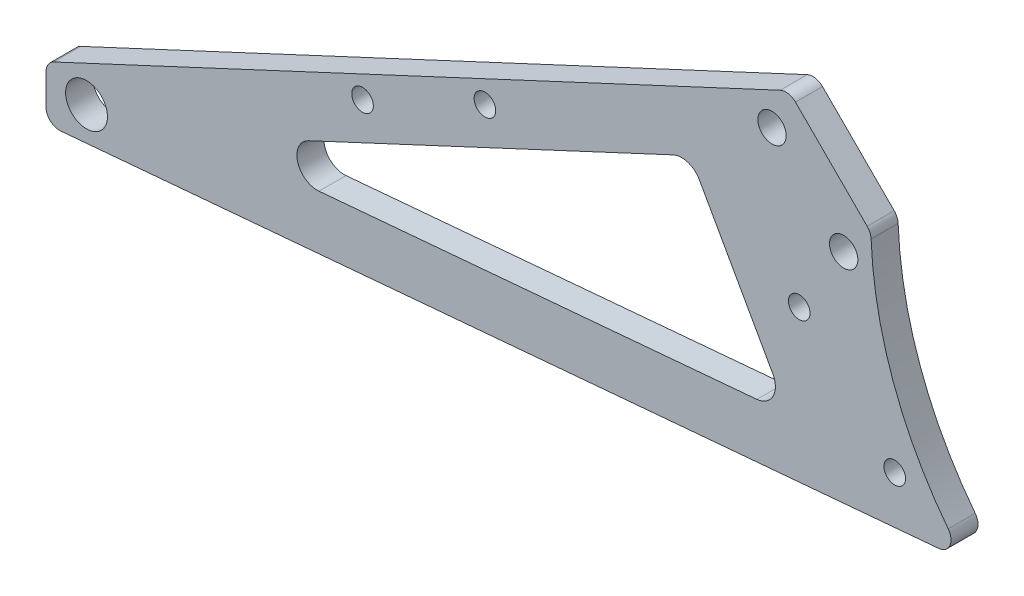
ISO-10303-21;
HEADER;
FILE_DESCRIPTION(('STEP AP214'),'2;1');
FILE_NAME('part.step','',(''),(''),'','','');
FILE_SCHEMA(('AUTOMOTIVE_DESIGN { 1 0 10303 214 1 1 1 1 }'));
ENDSEC;
DATA;
#1=APPLICATION_CONTEXT('core data for automotive mechanical design processes');
#2=APPLICATION_PROTOCOL_DEFINITION('international standard','automotive_design',2000,#1);
#3=PRODUCT_CONTEXT('',#1,'mechanical');
#4=PRODUCT('Part','Part','',(#3));
#5=PRODUCT_RELATED_PRODUCT_CATEGORY('part','',(#4));
#6=PRODUCT_DEFINITION_FORMATION('','',#4);
#7=PRODUCT_DEFINITION_CONTEXT('part definition',#1,'design');
#8=PRODUCT_DEFINITION('design','',#6,#7);
#9=PRODUCT_DEFINITION_SHAPE('','',#8);
#10=(LENGTH_UNIT() NAMED_UNIT(*) SI_UNIT(.MILLI.,.METRE.));
#11=(NAMED_UNIT(*) PLANE_ANGLE_UNIT() SI_UNIT($,.RADIAN.));
#12=(NAMED_UNIT(*) SI_UNIT($,.STERADIAN.) SOLID_ANGLE_UNIT());
#13=UNCERTAINTY_MEASURE_WITH_UNIT(LENGTH_MEASURE(1.E-05),#10,'distance_accuracy_value','');
#14=(GEOMETRIC_REPRESENTATION_CONTEXT(3) GLOBAL_UNCERTAINTY_ASSIGNED_CONTEXT((#13)) GLOBAL_UNIT_ASSIGNED_CONTEXT((#10,
#11,#12)) REPRESENTATION_CONTEXT('',''));
#15=CARTESIAN_POINT('',(0.,0.,0.));
#16=DIRECTION('',(0.,0.,1.));
#17=DIRECTION('',(1.,0.,0.));
#18=AXIS2_PLACEMENT_3D('',#15,#16,#17);
#19=CARTESIAN_POINT('',(67.1453009382805,-10.8085597787918,4.));
#20=DIRECTION('',(0.,0.,1.));
#21=DIRECTION('',(1.,0.,0.));
#22=AXIS2_PLACEMENT_3D('',#19,#20,#21);
#23=PLANE('',#22);
#24=DIRECTION('',(-0.488052623048348,0.872814205392893,0.));
#25=VECTOR('',#24,1.);
#26=CARTESIAN_POINT('',(-0.110692732415361,-41.5593104218611,4.));
#27=LINE('',#26,#25);
#28=CARTESIAN_POINT('',(-2.37248368296537,-37.5144120276288,4.));
#29=VERTEX_POINT('',#28);
#30=CARTESIAN_POINT('',(-13.2450822531965,-18.070282371364,4.));
#31=VERTEX_POINT('',#30);
#32=EDGE_CURVE('E286',#29,#31,#27,.T.);
#33=ORIENTED_EDGE('',*,*,#32,.F.);
#34=CARTESIAN_POINT('',(-4.99092629914405,-38.9785698967738,4.));
#35=DIRECTION('',(0.,0.,1.));
#36=DIRECTION('',(1.,0.,0.));
#37=AXIS2_PLACEMENT_3D('',#34,#35,#36);
#38=CIRCLE('',#37,3.);
#39=CARTESIAN_POINT('',(-4.72704819418893,-41.9669420867336,4.));
#40=VERTEX_POINT('',#39);
#41=EDGE_CURVE('E268',#29,#40,#38,.F.);
#42=ORIENTED_EDGE('',*,*,#41,.T.);
#43=DIRECTION('',(0.996124063319942,0.0879593683183776,0.));
#44=VECTOR('',#43,1.);
#45=CARTESIAN_POINT('',(-86.566111127394,-49.1934639070991,4.));
#46=LINE('',#45,#44);
#47=CARTESIAN_POINT('',(-69.5781435381829,-47.6933988517686,4.));
#48=VERTEX_POINT('',#47);
#49=EDGE_CURVE('E278',#48,#40,#46,.T.);
#50=ORIENTED_EDGE('',*,*,#49,.F.);
#51=CARTESIAN_POINT('',(-69.8420216431381,-44.7050266618088,4.));
#52=DIRECTION('',(0.,0.,1.));
#53=DIRECTION('',(1.,0.,0.));
#54=AXIS2_PLACEMENT_3D('',#51,#52,#53);
#55=CIRCLE('',#54,3.);
#56=CARTESIAN_POINT('',(-71.1098764283601,-41.9861033006988,4.));
#57=VERTEX_POINT('',#56);
#58=EDGE_CURVE('E48',#48,#57,#55,.F.);
#59=ORIENTED_EDGE('',*,*,#58,.T.);
#60=DIRECTION('',(-0.906307787036655,-0.422618261740689,0.));
#61=VECTOR('',#60,1.);
#62=CARTESIAN_POINT('',(-14.6053601461869,-15.6376146379784,4.));
#63=LINE('',#62,#61);
#64=CARTESIAN_POINT('',(-17.1313796545972,-16.8155168793991,4.));
#65=VERTEX_POINT('',#64);
#66=EDGE_CURVE('E277',#65,#57,#63,.T.);
#67=ORIENTED_EDGE('',*,*,#66,.F.);
#68=CARTESIAN_POINT('',(-15.8635248693752,-19.534440240509,4.));
#69=DIRECTION('',(0.,0.,1.));
#70=DIRECTION('',(1.,0.,0.));
#71=AXIS2_PLACEMENT_3D('',#68,#69,#70);
#72=CIRCLE('',#71,3.);
#73=EDGE_CURVE('E264',#65,#31,#72,.F.);
#74=ORIENTED_EDGE('',*,*,#73,.T.);
#75=EDGE_LOOP('',(#33,#42,#50,#59,#67,#74));
#76=FACE_BOUND('',#75,.T.);
#77=CARTESIAN_POINT('',(-45.,-24.2939783738617,4.));
#78=DIRECTION('',(0.,0.,1.));
#79=DIRECTION('',(1.,0.,0.));
#80=AXIS2_PLACEMENT_3D('',#77,#78,#79);
#81=CIRCLE('',#80,1.6);
#82=CARTESIAN_POINT('',(-43.4,-24.2939783738617,4.));
#83=VERTEX_POINT('',#82);
#84=EDGE_CURVE('E240',#83,#83,#81,.T.);
#85=ORIENTED_EDGE('',*,*,#84,.F.);
#86=EDGE_LOOP('',(#85));
#87=FACE_BOUND('',#86,.T.);
#88=CARTESIAN_POINT('',(-63.1261557407331,-32.7463436086755,4.));
#89=DIRECTION('',(0.,0.,1.));
#90=DIRECTION('',(1.,0.,0.));
#91=AXIS2_PLACEMENT_3D('',#88,#89,#90);
#92=CIRCLE('',#91,1.6);
#93=CARTESIAN_POINT('',(-61.5261557407331,-32.7463436086755,4.));
#94=VERTEX_POINT('',#93);
#95=EDGE_CURVE('E302',#94,#94,#92,.T.);
#96=ORIENTED_EDGE('',*,*,#95,.F.);
#97=EDGE_LOOP('',(#96));
#98=FACE_BOUND('',#97,.T.);
#99=CARTESIAN_POINT('',(-2.48528137423862,-6.,4.));
#100=DIRECTION('',(0.,0.,1.));
#101=DIRECTION('',(1.,0.,0.));
#102=AXIS2_PLACEMENT_3D('',#99,#100,#101);
#103=CIRCLE('',#102,2.1);
#104=CARTESIAN_POINT('',(-0.385281374238623,-6.,4.));
#105=VERTEX_POINT('',#104);
#106=EDGE_CURVE('E313',#105,#105,#103,.T.);
#107=ORIENTED_EDGE('',*,*,#106,.F.);
#108=EDGE_LOOP('',(#107));
#109=FACE_BOUND('',#108,.T.);
#110=CARTESIAN_POINT('',(8.12132034355943,-16.6066017177984,4.));
#111=DIRECTION('',(0.,0.,1.));
#112=DIRECTION('',(1.,0.,0.));
#113=AXIS2_PLACEMENT_3D('',#110,#111,#112);
#114=CIRCLE('',#113,2.1);
#115=CARTESIAN_POINT('',(10.2213203435594,-16.6066017177984,4.));
#116=VERTEX_POINT('',#115);
#117=EDGE_CURVE('E325',#116,#116,#114,.T.);
#118=ORIENTED_EDGE('',*,*,#117,.F.);
#119=EDGE_LOOP('',(#118));
#120=FACE_BOUND('',#119,.T.);
#121=CARTESIAN_POINT('',(67.1453009382805,-10.8085597787918,4.));
#122=DIRECTION('',(0.,0.,-1.));
#123=DIRECTION('',(1.,0.,0.));
#124=AXIS2_PLACEMENT_3D('',#121,#122,#123);
#125=CIRCLE('',#124,55.0000000000003);
#126=CARTESIAN_POINT('',(23.6005379703477,-44.4069766770115,4.));
#127=VERTEX_POINT('',#126);
#128=CARTESIAN_POINT('',(12.1865794076297,-12.9390357153855,4.));
#129=VERTEX_POINT('',#128);
#130=EDGE_CURVE('E190',#127,#129,#125,.T.);
#131=ORIENTED_EDGE('',*,*,#130,.T.);
#132=CARTESIAN_POINT('',(10.1880804428788,-13.0165075676253,4.));
#133=DIRECTION('',(0.,0.,1.));
#134=DIRECTION('',(1.,0.,0.));
#135=AXIS2_PLACEMENT_3D('',#132,#133,#134);
#136=CIRCLE('',#135,2.);
#137=CARTESIAN_POINT('',(11.6022940052519,-11.6022940052522,4.));
#138=VERTEX_POINT('',#137);
#139=EDGE_CURVE('E218',#129,#138,#136,.T.);
#140=ORIENTED_EDGE('',*,*,#139,.T.);
#141=DIRECTION('',(-0.707106781186537,0.707106781186558,0.));
#142=VECTOR('',#141,1.);
#143=CARTESIAN_POINT('',(0.,0.,4.));
#144=LINE('',#143,#142);
#145=CARTESIAN_POINT('',(0.990242997012051,-0.990242997012082,4.));
#146=VERTEX_POINT('',#145);
#147=EDGE_CURVE('E173',#138,#146,#144,.T.);
#148=ORIENTED_EDGE('',*,*,#147,.T.);
#149=CARTESIAN_POINT('',(-0.423970565361059,-2.40445655938515,4.));
#150=DIRECTION('',(0.,0.,1.));
#151=DIRECTION('',(1.,0.,0.));
#152=AXIS2_PLACEMENT_3D('',#149,#150,#151);
#153=CIRCLE('',#152,2.);
#154=CARTESIAN_POINT('',(-1.26920708884243,-0.591840985311821,4.));
#155=VERTEX_POINT('',#154);
#156=EDGE_CURVE('E210',#146,#155,#153,.T.);
#157=ORIENTED_EDGE('',*,*,#156,.T.);
#158=DIRECTION('',(-0.906307787036655,-0.422618261740689,0.));
#159=VECTOR('',#158,1.);
#160=CARTESIAN_POINT('',(-110.,-51.2938423970483,4.));
#161=LINE('',#160,#159);
#162=CARTESIAN_POINT('',(-108.845236523481,-50.7553673445899,4.));
#163=VERTEX_POINT('',#162);
#164=EDGE_CURVE('E333',#155,#163,#161,.T.);
#165=ORIENTED_EDGE('',*,*,#164,.T.);
#166=CARTESIAN_POINT('',(-108.,-52.5679829186633,4.));
#167=DIRECTION('',(0.,0.,1.));
#168=DIRECTION('',(1.,0.,0.));
#169=AXIS2_PLACEMENT_3D('',#166,#167,#168);
#170=CIRCLE('',#169,2.);
#171=CARTESIAN_POINT('',(-110.,-52.5679829186633,4.));
#172=VERTEX_POINT('',#171);
#173=EDGE_CURVE('E212',#163,#172,#170,.T.);
#174=ORIENTED_EDGE('',*,*,#173,.T.);
#175=DIRECTION('',(0.,-1.,0.));
#176=VECTOR('',#175,1.);
#177=CARTESIAN_POINT('',(-110.,-59.2938423970483,4.));
#178=LINE('',#177,#176);
#179=CARTESIAN_POINT('',(-110.,-57.1094571213982,4.));
#180=VERTEX_POINT('',#179);
#181=EDGE_CURVE('E336',#172,#180,#178,.T.);
#182=ORIENTED_EDGE('',*,*,#181,.T.);
#183=CARTESIAN_POINT('',(-108.,-57.1094571213982,4.));
#184=DIRECTION('',(0.,0.,1.));
#185=DIRECTION('',(1.,0.,0.));
#186=AXIS2_PLACEMENT_3D('',#183,#184,#185);
#187=CIRCLE('',#186,2.);
#188=CARTESIAN_POINT('',(-107.824081263363,-59.1017052480381,4.));
#189=VERTEX_POINT('',#188);
#190=EDGE_CURVE('E214',#180,#189,#187,.T.);
#191=ORIENTED_EDGE('',*,*,#190,.T.);
#192=DIRECTION('',(0.996124063319942,0.0879593683183777,0.));
#193=VECTOR('',#192,1.);
#194=CARTESIAN_POINT('',(25.9825746737338,-47.2863607880365,4.));
#195=LINE('',#194,#193);
#196=CARTESIAN_POINT('',(22.1930107808778,-47.6209854181321,4.));
#197=VERTEX_POINT('',#196);
#198=EDGE_CURVE('E338',#189,#197,#195,.T.);
#199=ORIENTED_EDGE('',*,*,#198,.T.);
#200=CARTESIAN_POINT('',(22.0170920442411,-45.6287372914922,4.));
#201=DIRECTION('',(0.,0.,1.));
#202=DIRECTION('',(1.,0.,0.));
#203=AXIS2_PLACEMENT_3D('',#200,#201,#202);
#204=CIRCLE('',#203,2.);
#205=EDGE_CURVE('E216',#197,#127,#204,.T.);
#206=ORIENTED_EDGE('',*,*,#205,.T.);
#207=EDGE_LOOP('',(#131,#140,#148,#157,#165,#174,#182,#191,#199,#206));
#208=FACE_BOUND('',#207,.T.);
#209=CARTESIAN_POINT('',(-104.,-53.8137596900725,4.));
#210=DIRECTION('',(0.,0.,1.));
#211=DIRECTION('',(1.,0.,0.));
#212=AXIS2_PLACEMENT_3D('',#209,#210,#211);
#213=CIRCLE('',#212,3.1);
#214=CARTESIAN_POINT('',(-100.9,-53.8137596900725,4.));
#215=VERTEX_POINT('',#214);
#216=EDGE_CURVE('E181',#215,#215,#213,.T.);
#217=ORIENTED_EDGE('',*,*,#216,.F.);
#218=EDGE_LOOP('',(#217));
#219=FACE_BOUND('',#218,.T.);
#220=CARTESIAN_POINT('',(1.54415587728385,-27.,4.));
#221=DIRECTION('',(0.,0.,1.));
#222=DIRECTION('',(1.,0.,0.));
#223=AXIS2_PLACEMENT_3D('',#220,#221,#222);
#224=CIRCLE('',#223,1.6);
#225=CARTESIAN_POINT('',(3.14415587728385,-27.,4.));
#226=VERTEX_POINT('',#225);
#227=EDGE_CURVE('E319',#226,#226,#224,.T.);
#228=ORIENTED_EDGE('',*,*,#227,.F.);
#229=EDGE_LOOP('',(#228));
#230=FACE_BOUND('',#229,.T.);
#231=CARTESIAN_POINT('',(15.6862915010146,-41.1421356237312,4.));
#232=DIRECTION('',(0.,0.,1.));
#233=DIRECTION('',(1.,0.,0.));
#234=AXIS2_PLACEMENT_3D('',#231,#232,#233);
#235=CIRCLE('',#234,1.60000000000001);
#236=CARTESIAN_POINT('',(17.2862915010146,-41.1421356237312,4.));
#237=VERTEX_POINT('',#236);
#238=EDGE_CURVE('E307',#237,#237,#235,.T.);
#239=ORIENTED_EDGE('',*,*,#238,.F.);
#240=EDGE_LOOP('',(#239));
#241=FACE_BOUND('',#240,.T.);
#242=ADVANCED_FACE('F40',(#76,#87,#98,#109,#120,#208,#219,#230,#241),#23,.T.);
#243=CARTESIAN_POINT('',(67.1453009382805,-10.8085597787918,0.));
#244=DIRECTION('',(0.,0.,1.));
#245=DIRECTION('',(1.,0.,0.));
#246=AXIS2_PLACEMENT_3D('',#243,#244,#245);
#247=PLANE('',#246);
#248=DIRECTION('',(-0.906307787036655,-0.422618261740689,0.));
#249=VECTOR('',#248,1.);
#250=CARTESIAN_POINT('',(54.3937617306355,16.5372042991529,0.));
#251=LINE('',#250,#249);
#252=CARTESIAN_POINT('',(-17.1313796545973,-16.8155168793991,0.));
#253=VERTEX_POINT('',#252);
#254=CARTESIAN_POINT('',(-71.1098764283602,-41.9861033006988,0.));
#255=VERTEX_POINT('',#254);
#256=EDGE_CURVE('E235',#253,#255,#251,.T.);
#257=ORIENTED_EDGE('',*,*,#256,.T.);
#258=CARTESIAN_POINT('',(-69.8420216431381,-44.7050266618088,0.));
#259=DIRECTION('',(0.,0.,1.));
#260=DIRECTION('',(1.,0.,0.));
#261=AXIS2_PLACEMENT_3D('',#258,#259,#260);
#262=CIRCLE('',#261,3.);
#263=CARTESIAN_POINT('',(-69.5781435381829,-47.6933988517686,0.));
#264=VERTEX_POINT('',#263);
#265=EDGE_CURVE('E11',#255,#264,#262,.T.);
#266=ORIENTED_EDGE('',*,*,#265,.T.);
#267=DIRECTION('',(0.996124063319942,0.0879593683183776,0.));
#268=VECTOR('',#267,1.);
#269=CARTESIAN_POINT('',(69.3192842757052,-35.4285309889861,0.));
#270=LINE('',#269,#268);
#271=CARTESIAN_POINT('',(-4.72704819418893,-41.9669420867336,0.));
#272=VERTEX_POINT('',#271);
#273=EDGE_CURVE('E245',#264,#272,#270,.T.);
#274=ORIENTED_EDGE('',*,*,#273,.T.);
#275=CARTESIAN_POINT('',(-4.99092629914405,-38.9785698967738,0.));
#276=DIRECTION('',(0.,0.,1.));
#277=DIRECTION('',(1.,0.,0.));
#278=AXIS2_PLACEMENT_3D('',#275,#276,#277);
#279=CIRCLE('',#278,3.);
#280=CARTESIAN_POINT('',(-2.37248368296536,-37.5144120276288,0.));
#281=VERTEX_POINT('',#280);
#282=EDGE_CURVE('E270',#272,#281,#279,.T.);
#283=ORIENTED_EDGE('',*,*,#282,.T.);
#284=DIRECTION('',(-0.488052623048347,0.872814205392893,0.));
#285=VECTOR('',#284,1.);
#286=CARTESIAN_POINT('',(2.8101910083413,-46.7829045607681,0.));
#287=LINE('',#286,#285);
#288=CARTESIAN_POINT('',(-13.2450822531965,-18.070282371364,0.));
#289=VERTEX_POINT('',#288);
#290=EDGE_CURVE('E247',#281,#289,#287,.T.);
#291=ORIENTED_EDGE('',*,*,#290,.T.);
#292=CARTESIAN_POINT('',(-15.8635248693752,-19.534440240509,0.));
#293=DIRECTION('',(0.,0.,1.));
#294=DIRECTION('',(1.,0.,0.));
#295=AXIS2_PLACEMENT_3D('',#292,#293,#294);
#296=CIRCLE('',#295,3.);
#297=EDGE_CURVE('E266',#289,#253,#296,.T.);
#298=ORIENTED_EDGE('',*,*,#297,.T.);
#299=EDGE_LOOP('',(#257,#266,#274,#283,#291,#298));
#300=FACE_BOUND('',#299,.T.);
#301=CARTESIAN_POINT('',(-45.,-24.2939783738617,0.));
#302=DIRECTION('',(0.,0.,1.));
#303=DIRECTION('',(1.,0.,0.));
#304=AXIS2_PLACEMENT_3D('',#301,#302,#303);
#305=CIRCLE('',#304,1.6);
#306=CARTESIAN_POINT('',(-43.4,-24.2939783738617,0.));
#307=VERTEX_POINT('',#306);
#308=EDGE_CURVE('E239',#307,#307,#305,.T.);
#309=ORIENTED_EDGE('',*,*,#308,.T.);
#310=EDGE_LOOP('',(#309));
#311=FACE_BOUND('',#310,.T.);
#312=CARTESIAN_POINT('',(-63.1261557407331,-32.7463436086755,0.));
#313=DIRECTION('',(0.,0.,1.));
#314=DIRECTION('',(1.,0.,0.));
#315=AXIS2_PLACEMENT_3D('',#312,#313,#314);
#316=CIRCLE('',#315,1.6);
#317=CARTESIAN_POINT('',(-61.5261557407331,-32.7463436086755,0.));
#318=VERTEX_POINT('',#317);
#319=EDGE_CURVE('E236',#318,#318,#316,.T.);
#320=ORIENTED_EDGE('',*,*,#319,.T.);
#321=EDGE_LOOP('',(#320));
#322=FACE_BOUND('',#321,.T.);
#323=DIRECTION('',(-0.707106781186537,0.707106781186558,0.));
#324=VECTOR('',#323,1.);
#325=CARTESIAN_POINT('',(0.,0.,0.));
#326=LINE('',#325,#324);
#327=CARTESIAN_POINT('',(11.6022940052519,-11.6022940052522,0.));
#328=VERTEX_POINT('',#327);
#329=CARTESIAN_POINT('',(0.990242997012051,-0.990242997012082,0.));
#330=VERTEX_POINT('',#329);
#331=EDGE_CURVE('E170',#328,#330,#326,.T.);
#332=ORIENTED_EDGE('',*,*,#331,.F.);
#333=CARTESIAN_POINT('',(10.1880804428788,-13.0165075676253,0.));
#334=DIRECTION('',(0.,0.,1.));
#335=DIRECTION('',(1.,0.,0.));
#336=AXIS2_PLACEMENT_3D('',#333,#334,#335);
#337=CIRCLE('',#336,2.);
#338=CARTESIAN_POINT('',(12.1865794076297,-12.9390357153855,0.));
#339=VERTEX_POINT('',#338);
#340=EDGE_CURVE('E153',#328,#339,#337,.F.);
#341=ORIENTED_EDGE('',*,*,#340,.T.);
#342=CARTESIAN_POINT('',(67.1453009382805,-10.8085597787918,0.));
#343=DIRECTION('',(0.,0.,-1.));
#344=DIRECTION('',(1.,0.,0.));
#345=AXIS2_PLACEMENT_3D('',#342,#343,#344);
#346=CIRCLE('',#345,55.0000000000003);
#347=CARTESIAN_POINT('',(23.6005379703477,-44.4069766770115,0.));
#348=VERTEX_POINT('',#347);
#349=EDGE_CURVE('E198',#348,#339,#346,.T.);
#350=ORIENTED_EDGE('',*,*,#349,.F.);
#351=CARTESIAN_POINT('',(22.0170920442411,-45.6287372914922,0.));
#352=DIRECTION('',(0.,0.,1.));
#353=DIRECTION('',(1.,0.,0.));
#354=AXIS2_PLACEMENT_3D('',#351,#352,#353);
#355=CIRCLE('',#354,2.);
#356=CARTESIAN_POINT('',(22.1930107808778,-47.6209854181321,0.));
#357=VERTEX_POINT('',#356);
#358=EDGE_CURVE('E164',#348,#357,#355,.F.);
#359=ORIENTED_EDGE('',*,*,#358,.T.);
#360=DIRECTION('',(0.996124063319942,0.0879593683183777,0.));
#361=VECTOR('',#360,1.);
#362=CARTESIAN_POINT('',(25.9825746737338,-47.2863607880365,0.));
#363=LINE('',#362,#361);
#364=CARTESIAN_POINT('',(-107.824081263363,-59.1017052480381,0.));
#365=VERTEX_POINT('',#364);
#366=EDGE_CURVE('E195',#365,#357,#363,.T.);
#367=ORIENTED_EDGE('',*,*,#366,.F.);
#368=CARTESIAN_POINT('',(-108.,-57.1094571213982,0.));
#369=DIRECTION('',(0.,0.,1.));
#370=DIRECTION('',(1.,0.,0.));
#371=AXIS2_PLACEMENT_3D('',#368,#369,#370);
#372=CIRCLE('',#371,2.);
#373=CARTESIAN_POINT('',(-110.,-57.1094571213982,0.));
#374=VERTEX_POINT('',#373);
#375=EDGE_CURVE('E204',#365,#374,#372,.F.);
#376=ORIENTED_EDGE('',*,*,#375,.T.);
#377=DIRECTION('',(0.,-1.,0.));
#378=VECTOR('',#377,1.);
#379=CARTESIAN_POINT('',(-110.,-59.2938423970483,0.));
#380=LINE('',#379,#378);
#381=CARTESIAN_POINT('',(-110.,-52.5679829186633,0.));
#382=VERTEX_POINT('',#381);
#383=EDGE_CURVE('E184',#382,#374,#380,.T.);
#384=ORIENTED_EDGE('',*,*,#383,.F.);
#385=CARTESIAN_POINT('',(-108.,-52.5679829186633,0.));
#386=DIRECTION('',(0.,0.,1.));
#387=DIRECTION('',(1.,0.,0.));
#388=AXIS2_PLACEMENT_3D('',#385,#386,#387);
#389=CIRCLE('',#388,2.);
#390=CARTESIAN_POINT('',(-108.845236523481,-50.7553673445899,0.));
#391=VERTEX_POINT('',#390);
#392=EDGE_CURVE('E202',#382,#391,#389,.F.);
#393=ORIENTED_EDGE('',*,*,#392,.T.);
#394=DIRECTION('',(-0.906307787036655,-0.422618261740689,0.));
#395=VECTOR('',#394,1.);
#396=CARTESIAN_POINT('',(-110.,-51.2938423970483,0.));
#397=LINE('',#396,#395);
#398=CARTESIAN_POINT('',(-1.26920708884243,-0.591840985311821,0.));
#399=VERTEX_POINT('',#398);
#400=EDGE_CURVE('E180',#399,#391,#397,.T.);
#401=ORIENTED_EDGE('',*,*,#400,.F.);
#402=CARTESIAN_POINT('',(-0.423970565361059,-2.40445655938515,0.));
#403=DIRECTION('',(0.,0.,1.));
#404=DIRECTION('',(1.,0.,0.));
#405=AXIS2_PLACEMENT_3D('',#402,#403,#404);
#406=CIRCLE('',#405,2.);
#407=EDGE_CURVE('E174',#399,#330,#406,.F.);
#408=ORIENTED_EDGE('',*,*,#407,.T.);
#409=EDGE_LOOP('',(#332,#341,#350,#359,#367,#376,#384,#393,#401,#408));
#410=FACE_BOUND('',#409,.T.);
#411=CARTESIAN_POINT('',(-104.,-53.8137596900725,0.));
#412=DIRECTION('',(0.,0.,1.));
#413=DIRECTION('',(1.,0.,0.));
#414=AXIS2_PLACEMENT_3D('',#411,#412,#413);
#415=CIRCLE('',#414,3.1);
#416=CARTESIAN_POINT('',(-100.9,-53.8137596900725,0.));
#417=VERTEX_POINT('',#416);
#418=EDGE_CURVE('E187',#417,#417,#415,.T.);
#419=ORIENTED_EDGE('',*,*,#418,.T.);
#420=EDGE_LOOP('',(#419));
#421=FACE_BOUND('',#420,.T.);
#422=CARTESIAN_POINT('',(8.12132034355943,-16.6066017177984,0.));
#423=DIRECTION('',(0.,0.,1.));
#424=DIRECTION('',(1.,0.,0.));
#425=AXIS2_PLACEMENT_3D('',#422,#423,#424);
#426=CIRCLE('',#425,2.1);
#427=CARTESIAN_POINT('',(10.2213203435594,-16.6066017177984,0.));
#428=VERTEX_POINT('',#427);
#429=EDGE_CURVE('E322',#428,#428,#426,.T.);
#430=ORIENTED_EDGE('',*,*,#429,.T.);
#431=EDGE_LOOP('',(#430));
#432=FACE_BOUND('',#431,.T.);
#433=CARTESIAN_POINT('',(1.54415587728385,-27.,0.));
#434=DIRECTION('',(0.,0.,1.));
#435=DIRECTION('',(1.,0.,0.));
#436=AXIS2_PLACEMENT_3D('',#433,#434,#435);
#437=CIRCLE('',#436,1.6);
#438=CARTESIAN_POINT('',(3.14415587728385,-27.,0.));
#439=VERTEX_POINT('',#438);
#440=EDGE_CURVE('E316',#439,#439,#437,.T.);
#441=ORIENTED_EDGE('',*,*,#440,.T.);
#442=EDGE_LOOP('',(#441));
#443=FACE_BOUND('',#442,.T.);
#444=CARTESIAN_POINT('',(-2.48528137423862,-6.,0.));
#445=DIRECTION('',(0.,0.,1.));
#446=DIRECTION('',(1.,0.,0.));
#447=AXIS2_PLACEMENT_3D('',#444,#445,#446);
#448=CIRCLE('',#447,2.1);
#449=CARTESIAN_POINT('',(-0.385281374238623,-6.,0.));
#450=VERTEX_POINT('',#449);
#451=EDGE_CURVE('E310',#450,#450,#448,.T.);
#452=ORIENTED_EDGE('',*,*,#451,.T.);
#453=EDGE_LOOP('',(#452));
#454=FACE_BOUND('',#453,.T.);
#455=CARTESIAN_POINT('',(15.6862915010146,-41.1421356237312,0.));
#456=DIRECTION('',(0.,0.,1.));
#457=DIRECTION('',(1.,0.,0.));
#458=AXIS2_PLACEMENT_3D('',#455,#456,#457);
#459=CIRCLE('',#458,1.60000000000001);
#460=CARTESIAN_POINT('',(17.2862915010146,-41.1421356237312,0.));
#461=VERTEX_POINT('',#460);
#462=EDGE_CURVE('E243',#461,#461,#459,.T.);
#463=ORIENTED_EDGE('',*,*,#462,.T.);
#464=EDGE_LOOP('',(#463));
#465=FACE_BOUND('',#464,.T.);
#466=ADVANCED_FACE('F177',(#300,#311,#322,#410,#421,#432,#443,#454,#465),#247,.F.);
#467=CARTESIAN_POINT('',(0.,0.,4.));
#468=DIRECTION('',(-0.707106781186558,-0.707106781186537,0.));
#469=DIRECTION('',(0.707106781186537,-0.707106781186558,0.));
#470=AXIS2_PLACEMENT_3D('',#467,#468,#469);
#471=PLANE('',#470);
#472=ORIENTED_EDGE('',*,*,#147,.F.);
#473=DIRECTION('',(0.,0.,-1.));
#474=VECTOR('',#473,1.);
#475=CARTESIAN_POINT('',(11.6022940052519,-11.6022940052522,4.));
#476=LINE('',#475,#474);
#477=EDGE_CURVE('E157',#138,#328,#476,.T.);
#478=ORIENTED_EDGE('',*,*,#477,.T.);
#479=ORIENTED_EDGE('',*,*,#331,.T.);
#480=DIRECTION('',(0.,0.,-1.));
#481=VECTOR('',#480,1.);
#482=CARTESIAN_POINT('',(0.990242997012051,-0.990242997012081,4.));
#483=LINE('',#482,#481);
#484=EDGE_CURVE('E175',#330,#146,#483,.F.);
#485=ORIENTED_EDGE('',*,*,#484,.T.);
#486=EDGE_LOOP('',(#472,#478,#479,#485));
#487=FACE_BOUND('',#486,.T.);
#488=ADVANCED_FACE('F169',(#487),#471,.F.);
#489=CARTESIAN_POINT('',(-110.,-51.2938423970483,4.));
#490=DIRECTION('',(0.422618261740689,-0.906307787036655,0.));
#491=DIRECTION('',(0.906307787036655,0.422618261740689,0.));
#492=AXIS2_PLACEMENT_3D('',#489,#490,#491);
#493=PLANE('',#492);
#494=ORIENTED_EDGE('',*,*,#400,.T.);
#495=DIRECTION('',(0.,0.,-1.));
#496=VECTOR('',#495,1.);
#497=CARTESIAN_POINT('',(-108.845236523481,-50.7553673445899,4.));
#498=LINE('',#497,#496);
#499=EDGE_CURVE('E233',#391,#163,#498,.F.);
#500=ORIENTED_EDGE('',*,*,#499,.T.);
#501=ORIENTED_EDGE('',*,*,#164,.F.);
#502=DIRECTION('',(0.,0.,-1.));
#503=VECTOR('',#502,1.);
#504=CARTESIAN_POINT('',(-1.26920708884244,-0.591840985311835,4.));
#505=LINE('',#504,#503);
#506=EDGE_CURVE('E230',#155,#399,#505,.T.);
#507=ORIENTED_EDGE('',*,*,#506,.T.);
#508=EDGE_LOOP('',(#494,#500,#501,#507));
#509=FACE_BOUND('',#508,.T.);
#510=ADVANCED_FACE('F370',(#509),#493,.F.);
#511=CARTESIAN_POINT('',(-110.,-59.2938423970483,4.));
#512=DIRECTION('',(1.,0.,0.));
#513=DIRECTION('',(0.,0.,-1.));
#514=AXIS2_PLACEMENT_3D('',#511,#512,#513);
#515=PLANE('',#514);
#516=ORIENTED_EDGE('',*,*,#383,.T.);
#517=DIRECTION('',(0.,0.,-1.));
#518=VECTOR('',#517,1.);
#519=CARTESIAN_POINT('',(-110.,-57.1094571213982,4.));
#520=LINE('',#519,#518);
#521=EDGE_CURVE('E228',#374,#180,#520,.F.);
#522=ORIENTED_EDGE('',*,*,#521,.T.);
#523=ORIENTED_EDGE('',*,*,#181,.F.);
#524=DIRECTION('',(0.,0.,-1.));
#525=VECTOR('',#524,1.);
#526=CARTESIAN_POINT('',(-110.,-52.5679829186633,4.));
#527=LINE('',#526,#525);
#528=EDGE_CURVE('E225',#172,#382,#527,.T.);
#529=ORIENTED_EDGE('',*,*,#528,.T.);
#530=EDGE_LOOP('',(#516,#522,#523,#529));
#531=FACE_BOUND('',#530,.T.);
#532=ADVANCED_FACE('F362',(#531),#515,.F.);
#533=CARTESIAN_POINT('',(25.9825746737338,-47.2863607880365,4.));
#534=DIRECTION('',(-0.0879593683183777,0.996124063319942,0.));
#535=DIRECTION('',(-0.996124063319942,-0.0879593683183777,0.));
#536=AXIS2_PLACEMENT_3D('',#533,#534,#535);
#537=PLANE('',#536);
#538=ORIENTED_EDGE('',*,*,#366,.T.);
#539=DIRECTION('',(0.,0.,-1.));
#540=VECTOR('',#539,1.);
#541=CARTESIAN_POINT('',(22.1930107808778,-47.6209854181321,4.));
#542=LINE('',#541,#540);
#543=EDGE_CURVE('E223',#357,#197,#542,.F.);
#544=ORIENTED_EDGE('',*,*,#543,.T.);
#545=ORIENTED_EDGE('',*,*,#198,.F.);
#546=DIRECTION('',(0.,0.,-1.));
#547=VECTOR('',#546,1.);
#548=CARTESIAN_POINT('',(-107.824081263363,-59.1017052480381,4.));
#549=LINE('',#548,#547);
#550=EDGE_CURVE('E220',#189,#365,#549,.T.);
#551=ORIENTED_EDGE('',*,*,#550,.T.);
#552=EDGE_LOOP('',(#538,#544,#545,#551));
#553=FACE_BOUND('',#552,.T.);
#554=ADVANCED_FACE('F354',(#553),#537,.F.);
#555=CARTESIAN_POINT('',(67.1453009382805,-10.8085597787918,4.));
#556=DIRECTION('',(0.,0.,-1.));
#557=DIRECTION('',(-1.,0.,0.));
#558=AXIS2_PLACEMENT_3D('',#555,#556,#557);
#559=CYLINDRICAL_SURFACE('',#558,55.0000000000003);
#560=ORIENTED_EDGE('',*,*,#349,.T.);
#561=DIRECTION('',(0.,0.,-1.));
#562=VECTOR('',#561,1.);
#563=CARTESIAN_POINT('',(12.1865794076297,-12.9390357153855,4.));
#564=LINE('',#563,#562);
#565=EDGE_CURVE('E158',#339,#129,#564,.F.);
#566=ORIENTED_EDGE('',*,*,#565,.T.);
#567=ORIENTED_EDGE('',*,*,#130,.F.);
#568=DIRECTION('',(0.,0.,-1.));
#569=VECTOR('',#568,1.);
#570=CARTESIAN_POINT('',(23.6005379703477,-44.4069766770115,4.));
#571=LINE('',#570,#569);
#572=EDGE_CURVE('E163',#127,#348,#571,.T.);
#573=ORIENTED_EDGE('',*,*,#572,.T.);
#574=EDGE_LOOP('',(#560,#566,#567,#573));
#575=FACE_BOUND('',#574,.T.);
#576=ADVANCED_FACE('F348',(#575),#559,.F.);
#577=CARTESIAN_POINT('',(-104.,-53.8137596900725,4.));
#578=DIRECTION('',(0.,0.,-1.));
#579=DIRECTION('',(-1.,0.,0.));
#580=AXIS2_PLACEMENT_3D('',#577,#578,#579);
#581=CYLINDRICAL_SURFACE('',#580,3.1);
#582=ORIENTED_EDGE('',*,*,#216,.T.);
#583=EDGE_LOOP('',(#582));
#584=FACE_BOUND('',#583,.T.);
#585=ORIENTED_EDGE('',*,*,#418,.F.);
#586=EDGE_LOOP('',(#585));
#587=FACE_BOUND('',#586,.T.);
#588=ADVANCED_FACE('F395',(#584,#587),#581,.F.);
#589=CARTESIAN_POINT('',(8.12132034355943,-16.6066017177984,4.));
#590=DIRECTION('',(0.,0.,-1.));
#591=DIRECTION('',(-1.,0.,0.));
#592=AXIS2_PLACEMENT_3D('',#589,#590,#591);
#593=CYLINDRICAL_SURFACE('',#592,2.1);
#594=ORIENTED_EDGE('',*,*,#117,.T.);
#595=EDGE_LOOP('',(#594));
#596=FACE_BOUND('',#595,.T.);
#597=ORIENTED_EDGE('',*,*,#429,.F.);
#598=EDGE_LOOP('',(#597));
#599=FACE_BOUND('',#598,.T.);
#600=ADVANCED_FACE('F516',(#596,#599),#593,.F.);
#601=CARTESIAN_POINT('',(1.54415587728385,-27.,4.));
#602=DIRECTION('',(0.,0.,-1.));
#603=DIRECTION('',(-1.,0.,0.));
#604=AXIS2_PLACEMENT_3D('',#601,#602,#603);
#605=CYLINDRICAL_SURFACE('',#604,1.6);
#606=ORIENTED_EDGE('',*,*,#227,.T.);
#607=EDGE_LOOP('',(#606));
#608=FACE_BOUND('',#607,.T.);
#609=ORIENTED_EDGE('',*,*,#440,.F.);
#610=EDGE_LOOP('',(#609));
#611=FACE_BOUND('',#610,.T.);
#612=ADVANCED_FACE('F513',(#608,#611),#605,.F.);
#613=CARTESIAN_POINT('',(-2.48528137423862,-6.,4.));
#614=DIRECTION('',(0.,0.,-1.));
#615=DIRECTION('',(-1.,0.,0.));
#616=AXIS2_PLACEMENT_3D('',#613,#614,#615);
#617=CYLINDRICAL_SURFACE('',#616,2.1);
#618=ORIENTED_EDGE('',*,*,#106,.T.);
#619=EDGE_LOOP('',(#618));
#620=FACE_BOUND('',#619,.T.);
#621=ORIENTED_EDGE('',*,*,#451,.F.);
#622=EDGE_LOOP('',(#621));
#623=FACE_BOUND('',#622,.T.);
#624=ADVANCED_FACE('F509',(#620,#623),#617,.F.);
#625=CARTESIAN_POINT('',(15.6862915010146,-41.1421356237312,4.));
#626=DIRECTION('',(0.,0.,-1.));
#627=DIRECTION('',(-1.,0.,0.));
#628=AXIS2_PLACEMENT_3D('',#625,#626,#627);
#629=CYLINDRICAL_SURFACE('',#628,1.60000000000001);
#630=ORIENTED_EDGE('',*,*,#238,.T.);
#631=EDGE_LOOP('',(#630));
#632=FACE_BOUND('',#631,.T.);
#633=ORIENTED_EDGE('',*,*,#462,.F.);
#634=EDGE_LOOP('',(#633));
#635=FACE_BOUND('',#634,.T.);
#636=ADVANCED_FACE('F410',(#632,#635),#629,.F.);
#637=CARTESIAN_POINT('',(10.1880804428788,-13.0165075676253,4.));
#638=DIRECTION('',(0.,0.,-1.));
#639=DIRECTION('',(-1.,0.,0.));
#640=AXIS2_PLACEMENT_3D('',#637,#638,#639);
#641=CYLINDRICAL_SURFACE('',#640,2.);
#642=ORIENTED_EDGE('',*,*,#139,.F.);
#643=ORIENTED_EDGE('',*,*,#565,.F.);
#644=ORIENTED_EDGE('',*,*,#340,.F.);
#645=ORIENTED_EDGE('',*,*,#477,.F.);
#646=EDGE_LOOP('',(#642,#643,#644,#645));
#647=FACE_BOUND('',#646,.T.);
#648=ADVANCED_FACE('F156',(#647),#641,.T.);
#649=CARTESIAN_POINT('',(22.0170920442411,-45.6287372914922,4.));
#650=DIRECTION('',(0.,0.,-1.));
#651=DIRECTION('',(-1.,0.,0.));
#652=AXIS2_PLACEMENT_3D('',#649,#650,#651);
#653=CYLINDRICAL_SURFACE('',#652,2.);
#654=ORIENTED_EDGE('',*,*,#205,.F.);
#655=ORIENTED_EDGE('',*,*,#543,.F.);
#656=ORIENTED_EDGE('',*,*,#358,.F.);
#657=ORIENTED_EDGE('',*,*,#572,.F.);
#658=EDGE_LOOP('',(#654,#655,#656,#657));
#659=FACE_BOUND('',#658,.T.);
#660=ADVANCED_FACE('F350',(#659),#653,.T.);
#661=CARTESIAN_POINT('',(-108.,-57.1094571213982,4.));
#662=DIRECTION('',(0.,0.,-1.));
#663=DIRECTION('',(-1.,0.,0.));
#664=AXIS2_PLACEMENT_3D('',#661,#662,#663);
#665=CYLINDRICAL_SURFACE('',#664,2.);
#666=ORIENTED_EDGE('',*,*,#190,.F.);
#667=ORIENTED_EDGE('',*,*,#521,.F.);
#668=ORIENTED_EDGE('',*,*,#375,.F.);
#669=ORIENTED_EDGE('',*,*,#550,.F.);
#670=EDGE_LOOP('',(#666,#667,#668,#669));
#671=FACE_BOUND('',#670,.T.);
#672=ADVANCED_FACE('F358',(#671),#665,.T.);
#673=CARTESIAN_POINT('',(-108.,-52.5679829186633,4.));
#674=DIRECTION('',(0.,0.,-1.));
#675=DIRECTION('',(-1.,0.,0.));
#676=AXIS2_PLACEMENT_3D('',#673,#674,#675);
#677=CYLINDRICAL_SURFACE('',#676,2.);
#678=ORIENTED_EDGE('',*,*,#173,.F.);
#679=ORIENTED_EDGE('',*,*,#499,.F.);
#680=ORIENTED_EDGE('',*,*,#392,.F.);
#681=ORIENTED_EDGE('',*,*,#528,.F.);
#682=EDGE_LOOP('',(#678,#679,#680,#681));
#683=FACE_BOUND('',#682,.T.);
#684=ADVANCED_FACE('F367',(#683),#677,.T.);
#685=CARTESIAN_POINT('',(-0.423970565361059,-2.40445655938515,4.));
#686=DIRECTION('',(0.,0.,-1.));
#687=DIRECTION('',(-1.,0.,0.));
#688=AXIS2_PLACEMENT_3D('',#685,#686,#687);
#689=CYLINDRICAL_SURFACE('',#688,2.);
#690=ORIENTED_EDGE('',*,*,#156,.F.);
#691=ORIENTED_EDGE('',*,*,#484,.F.);
#692=ORIENTED_EDGE('',*,*,#407,.F.);
#693=ORIENTED_EDGE('',*,*,#506,.F.);
#694=EDGE_LOOP('',(#690,#691,#692,#693));
#695=FACE_BOUND('',#694,.T.);
#696=ADVANCED_FACE('F375',(#695),#689,.T.);
#697=CARTESIAN_POINT('',(-63.1261557407331,-32.7463436086755,-16.));
#698=DIRECTION('',(0.,0.,1.));
#699=DIRECTION('',(1.,0.,0.));
#700=AXIS2_PLACEMENT_3D('',#697,#698,#699);
#701=CYLINDRICAL_SURFACE('',#700,1.6);
#702=ORIENTED_EDGE('',*,*,#95,.T.);
#703=EDGE_LOOP('',(#702));
#704=FACE_BOUND('',#703,.T.);
#705=ORIENTED_EDGE('',*,*,#319,.F.);
#706=EDGE_LOOP('',(#705));
#707=FACE_BOUND('',#706,.T.);
#708=ADVANCED_FACE('F377',(#704,#707),#701,.F.);
#709=CARTESIAN_POINT('',(-45.,-24.2939783738617,-16.));
#710=DIRECTION('',(0.,0.,1.));
#711=DIRECTION('',(1.,0.,0.));
#712=AXIS2_PLACEMENT_3D('',#709,#710,#711);
#713=CYLINDRICAL_SURFACE('',#712,1.6);
#714=ORIENTED_EDGE('',*,*,#84,.T.);
#715=EDGE_LOOP('',(#714));
#716=FACE_BOUND('',#715,.T.);
#717=ORIENTED_EDGE('',*,*,#308,.F.);
#718=EDGE_LOOP('',(#717));
#719=FACE_BOUND('',#718,.T.);
#720=ADVANCED_FACE('F383',(#716,#719),#713,.F.);
#721=CARTESIAN_POINT('',(-0.110692732415361,-41.5593104218611,-6.));
#722=DIRECTION('',(0.872814205392893,0.488052623048347,0.));
#723=DIRECTION('',(-0.488052623048347,0.872814205392893,0.));
#724=AXIS2_PLACEMENT_3D('',#721,#722,#723);
#725=PLANE('',#724);
#726=ORIENTED_EDGE('',*,*,#32,.T.);
#727=DIRECTION('',(0.,0.,1.));
#728=VECTOR('',#727,1.);
#729=CARTESIAN_POINT('',(-13.2450822531965,-18.070282371364,0.));
#730=LINE('',#729,#728);
#731=EDGE_CURVE('E258',#31,#289,#730,.F.);
#732=ORIENTED_EDGE('',*,*,#731,.T.);
#733=ORIENTED_EDGE('',*,*,#290,.F.);
#734=DIRECTION('',(0.,0.,1.));
#735=VECTOR('',#734,1.);
#736=CARTESIAN_POINT('',(-2.37248368296537,-37.5144120276288,4.));
#737=LINE('',#736,#735);
#738=EDGE_CURVE('E255',#281,#29,#737,.T.);
#739=ORIENTED_EDGE('',*,*,#738,.T.);
#740=EDGE_LOOP('',(#726,#732,#733,#739));
#741=FACE_BOUND('',#740,.T.);
#742=ADVANCED_FACE('F297',(#741),#725,.F.);
#743=CARTESIAN_POINT('',(-86.566111127394,-49.1934639070991,-6.));
#744=DIRECTION('',(0.0879593683183776,-0.996124063319942,0.));
#745=DIRECTION('',(0.996124063319942,0.0879593683183776,0.));
#746=AXIS2_PLACEMENT_3D('',#743,#744,#745);
#747=PLANE('',#746);
#748=ORIENTED_EDGE('',*,*,#49,.T.);
#749=DIRECTION('',(0.,0.,1.));
#750=VECTOR('',#749,1.);
#751=CARTESIAN_POINT('',(-4.72704819418892,-41.9669420867336,0.));
#752=LINE('',#751,#750);
#753=EDGE_CURVE('E55',#40,#272,#752,.F.);
#754=ORIENTED_EDGE('',*,*,#753,.T.);
#755=ORIENTED_EDGE('',*,*,#273,.F.);
#756=DIRECTION('',(0.,0.,1.));
#757=VECTOR('',#756,1.);
#758=CARTESIAN_POINT('',(-69.5781435381829,-47.6933988517686,4.));
#759=LINE('',#758,#757);
#760=EDGE_CURVE('E260',#264,#48,#759,.T.);
#761=ORIENTED_EDGE('',*,*,#760,.T.);
#762=EDGE_LOOP('',(#748,#754,#755,#761));
#763=FACE_BOUND('',#762,.T.);
#764=ADVANCED_FACE('F288',(#763),#747,.F.);
#765=CARTESIAN_POINT('',(-14.6053601461869,-15.6376146379784,-6.));
#766=DIRECTION('',(-0.422618261740689,0.906307787036655,0.));
#767=DIRECTION('',(-0.906307787036655,-0.422618261740689,0.));
#768=AXIS2_PLACEMENT_3D('',#765,#766,#767);
#769=PLANE('',#768);
#770=ORIENTED_EDGE('',*,*,#256,.F.);
#771=DIRECTION('',(0.,0.,1.));
#772=VECTOR('',#771,1.);
#773=CARTESIAN_POINT('',(-17.1313796545972,-16.8155168793991,4.));
#774=LINE('',#773,#772);
#775=EDGE_CURVE('E252',#253,#65,#774,.T.);
#776=ORIENTED_EDGE('',*,*,#775,.T.);
#777=ORIENTED_EDGE('',*,*,#66,.T.);
#778=DIRECTION('',(0.,0.,1.));
#779=VECTOR('',#778,1.);
#780=CARTESIAN_POINT('',(-71.1098764283601,-41.9861033006988,0.));
#781=LINE('',#780,#779);
#782=EDGE_CURVE('E250',#57,#255,#781,.F.);
#783=ORIENTED_EDGE('',*,*,#782,.T.);
#784=EDGE_LOOP('',(#770,#776,#777,#783));
#785=FACE_BOUND('',#784,.T.);
#786=ADVANCED_FACE('F284',(#785),#769,.F.);
#787=CARTESIAN_POINT('',(-15.8635248693752,-19.534440240509,-6.));
#788=DIRECTION('',(0.,0.,-1.));
#789=DIRECTION('',(-1.,0.,0.));
#790=AXIS2_PLACEMENT_3D('',#787,#788,#789);
#791=CYLINDRICAL_SURFACE('',#790,3.);
#792=ORIENTED_EDGE('',*,*,#297,.F.);
#793=ORIENTED_EDGE('',*,*,#731,.F.);
#794=ORIENTED_EDGE('',*,*,#73,.F.);
#795=ORIENTED_EDGE('',*,*,#775,.F.);
#796=EDGE_LOOP('',(#792,#793,#794,#795));
#797=FACE_BOUND('',#796,.T.);
#798=ADVANCED_FACE('F479',(#797),#791,.F.);
#799=CARTESIAN_POINT('',(-4.99092629914405,-38.9785698967738,-6.));
#800=DIRECTION('',(0.,0.,-1.));
#801=DIRECTION('',(-1.,0.,0.));
#802=AXIS2_PLACEMENT_3D('',#799,#800,#801);
#803=CYLINDRICAL_SURFACE('',#802,3.);
#804=ORIENTED_EDGE('',*,*,#282,.F.);
#805=ORIENTED_EDGE('',*,*,#753,.F.);
#806=ORIENTED_EDGE('',*,*,#41,.F.);
#807=ORIENTED_EDGE('',*,*,#738,.F.);
#808=EDGE_LOOP('',(#804,#805,#806,#807));
#809=FACE_BOUND('',#808,.T.);
#810=ADVANCED_FACE('F294',(#809),#803,.F.);
#811=CARTESIAN_POINT('',(-69.8420216431381,-44.7050266618088,-6.));
#812=DIRECTION('',(0.,0.,-1.));
#813=DIRECTION('',(-1.,0.,0.));
#814=AXIS2_PLACEMENT_3D('',#811,#812,#813);
#815=CYLINDRICAL_SURFACE('',#814,3.);
#816=ORIENTED_EDGE('',*,*,#265,.F.);
#817=ORIENTED_EDGE('',*,*,#782,.F.);
#818=ORIENTED_EDGE('',*,*,#58,.F.);
#819=ORIENTED_EDGE('',*,*,#760,.F.);
#820=EDGE_LOOP('',(#816,#817,#818,#819));
#821=FACE_BOUND('',#820,.T.);
#822=ADVANCED_FACE('F42',(#821),#815,.F.);
#823=CLOSED_SHELL('',(#242,#466,#488,#510,#532,#554,#576,#588,#600,#612,#624,#636,#648,#660,
#672,#684,#696,#708,#720,#742,#764,#786,#798,#810,#822));
#824=MANIFOLD_SOLID_BREP('B2',#823);
#825=ADVANCED_BREP_SHAPE_REPRESENTATION('',(#18,#824),#14);
#826=SHAPE_DEFINITION_REPRESENTATION(#9,#825);
ENDSEC;
END-ISO-10303-21;
